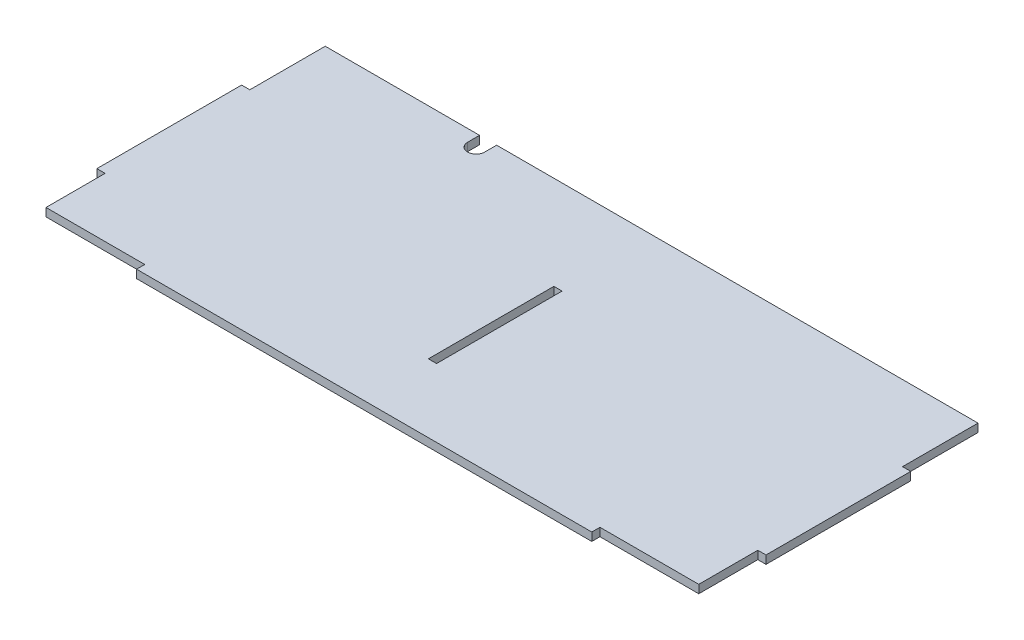
ISO-10303-21;
HEADER;
FILE_DESCRIPTION(('STEP AP214'),'2;1');
FILE_NAME('part.step','',(''),(''),'','','');
FILE_SCHEMA(('AUTOMOTIVE_DESIGN { 1 0 10303 214 1 1 1 1 }'));
ENDSEC;
DATA;
#1=APPLICATION_CONTEXT('core data for automotive mechanical design processes');
#2=APPLICATION_PROTOCOL_DEFINITION('international standard','automotive_design',2000,#1);
#3=PRODUCT_CONTEXT('',#1,'mechanical');
#4=PRODUCT('Part','Part','',(#3));
#5=PRODUCT_RELATED_PRODUCT_CATEGORY('part','',(#4));
#6=PRODUCT_DEFINITION_FORMATION('','',#4);
#7=PRODUCT_DEFINITION_CONTEXT('part definition',#1,'design');
#8=PRODUCT_DEFINITION('design','',#6,#7);
#9=PRODUCT_DEFINITION_SHAPE('','',#8);
#10=(LENGTH_UNIT() NAMED_UNIT(*) SI_UNIT(.MILLI.,.METRE.));
#11=(NAMED_UNIT(*) PLANE_ANGLE_UNIT() SI_UNIT($,.RADIAN.));
#12=(NAMED_UNIT(*) SI_UNIT($,.STERADIAN.) SOLID_ANGLE_UNIT());
#13=UNCERTAINTY_MEASURE_WITH_UNIT(LENGTH_MEASURE(1.E-05),#10,'distance_accuracy_value','');
#14=(GEOMETRIC_REPRESENTATION_CONTEXT(3) GLOBAL_UNCERTAINTY_ASSIGNED_CONTEXT((#13)) GLOBAL_UNIT_ASSIGNED_CONTEXT((#10,
#11,#12)) REPRESENTATION_CONTEXT('',''));
#15=CARTESIAN_POINT('',(0.,0.,0.));
#16=DIRECTION('',(0.,0.,1.));
#17=DIRECTION('',(1.,0.,0.));
#18=AXIS2_PLACEMENT_3D('',#15,#16,#17);
#19=CARTESIAN_POINT('',(0.,6.,-210.49));
#20=DIRECTION('',(0.,0.,1.));
#21=DIRECTION('',(1.,0.,0.));
#22=AXIS2_PLACEMENT_3D('',#19,#20,#21);
#23=PLANE('',#22);
#24=DIRECTION('',(-1.,0.,0.));
#25=VECTOR('',#24,1.);
#26=CARTESIAN_POINT('',(0.,0.,-210.49));
#27=LINE('',#26,#25);
#28=CARTESIAN_POINT('',(484.,0.,-210.49));
#29=VERTEX_POINT('',#28);
#30=CARTESIAN_POINT('',(131.5,0.,-210.49));
#31=VERTEX_POINT('',#30);
#32=EDGE_CURVE('E37',#29,#31,#27,.T.);
#33=ORIENTED_EDGE('',*,*,#32,.T.);
#34=DIRECTION('',(0.,1.,0.));
#35=VECTOR('',#34,1.);
#36=CARTESIAN_POINT('',(131.5,0.,-210.49));
#37=LINE('',#36,#35);
#38=CARTESIAN_POINT('',(131.5,6.,-210.49));
#39=VERTEX_POINT('',#38);
#40=EDGE_CURVE('E362',#31,#39,#37,.T.);
#41=ORIENTED_EDGE('',*,*,#40,.T.);
#42=DIRECTION('',(-1.,0.,0.));
#43=VECTOR('',#42,1.);
#44=CARTESIAN_POINT('',(0.,6.,-210.49));
#45=LINE('',#44,#43);
#46=CARTESIAN_POINT('',(484.,6.,-210.49));
#47=VERTEX_POINT('',#46);
#48=EDGE_CURVE('E11',#47,#39,#45,.T.);
#49=ORIENTED_EDGE('',*,*,#48,.F.);
#50=DIRECTION('',(0.,1.,0.));
#51=VECTOR('',#50,1.);
#52=CARTESIAN_POINT('',(484.,0.,-210.49));
#53=LINE('',#52,#51);
#54=EDGE_CURVE('E328',#29,#47,#53,.T.);
#55=ORIENTED_EDGE('',*,*,#54,.F.);
#56=EDGE_LOOP('',(#33,#41,#49,#55));
#57=FACE_BOUND('',#56,.T.);
#58=ADVANCED_FACE('F33',(#57),#23,.F.);
#59=CARTESIAN_POINT('',(0.,6.,0.));
#60=DIRECTION('',(1.,0.,0.));
#61=DIRECTION('',(0.,0.,-1.));
#62=AXIS2_PLACEMENT_3D('',#59,#60,#61);
#63=PLANE('',#62);
#64=DIRECTION('',(0.,0.,1.));
#65=VECTOR('',#64,1.);
#66=CARTESIAN_POINT('',(0.,6.,0.));
#67=LINE('',#66,#65);
#68=CARTESIAN_POINT('',(0.,6.,-155.24));
#69=VERTEX_POINT('',#68);
#70=CARTESIAN_POINT('',(0.,6.,-49.25));
#71=VERTEX_POINT('',#70);
#72=EDGE_CURVE('E222',#69,#71,#67,.T.);
#73=ORIENTED_EDGE('',*,*,#72,.F.);
#74=DIRECTION('',(0.,1.,0.));
#75=VECTOR('',#74,1.);
#76=CARTESIAN_POINT('',(0.,0.,-155.24));
#77=LINE('',#76,#75);
#78=CARTESIAN_POINT('',(0.,0.,-155.24));
#79=VERTEX_POINT('',#78);
#80=EDGE_CURVE('E313',#79,#69,#77,.T.);
#81=ORIENTED_EDGE('',*,*,#80,.F.);
#82=DIRECTION('',(0.,0.,1.));
#83=VECTOR('',#82,1.);
#84=CARTESIAN_POINT('',(0.,0.,0.));
#85=LINE('',#84,#83);
#86=CARTESIAN_POINT('',(0.,0.,-49.25));
#87=VERTEX_POINT('',#86);
#88=EDGE_CURVE('E229',#79,#87,#85,.T.);
#89=ORIENTED_EDGE('',*,*,#88,.T.);
#90=DIRECTION('',(0.,1.,0.));
#91=VECTOR('',#90,1.);
#92=CARTESIAN_POINT('',(0.,0.,-49.25));
#93=LINE('',#92,#91);
#94=EDGE_CURVE('E286',#87,#71,#93,.T.);
#95=ORIENTED_EDGE('',*,*,#94,.T.);
#96=EDGE_LOOP('',(#73,#81,#89,#95));
#97=FACE_BOUND('',#96,.T.);
#98=ADVANCED_FACE('F35',(#97),#63,.F.);
#99=CARTESIAN_POINT('',(0.,6.,0.));
#100=DIRECTION('',(0.,0.,-1.));
#101=DIRECTION('',(-1.,0.,0.));
#102=AXIS2_PLACEMENT_3D('',#99,#100,#101);
#103=PLANE('',#102);
#104=DIRECTION('',(1.,0.,0.));
#105=VECTOR('',#104,1.);
#106=CARTESIAN_POINT('',(0.,6.,0.));
#107=LINE('',#106,#105);
#108=CARTESIAN_POINT('',(78.33333333,6.,0.));
#109=VERTEX_POINT('',#108);
#110=CARTESIAN_POINT('',(411.666666663333,6.,0.));
#111=VERTEX_POINT('',#110);
#112=EDGE_CURVE('E238',#109,#111,#107,.T.);
#113=ORIENTED_EDGE('',*,*,#112,.F.);
#114=DIRECTION('',(0.,1.,0.));
#115=VECTOR('',#114,1.);
#116=CARTESIAN_POINT('',(78.33333333,0.,0.));
#117=LINE('',#116,#115);
#118=CARTESIAN_POINT('',(78.33333333,0.,0.));
#119=VERTEX_POINT('',#118);
#120=EDGE_CURVE('E277',#119,#109,#117,.T.);
#121=ORIENTED_EDGE('',*,*,#120,.F.);
#122=DIRECTION('',(1.,0.,0.));
#123=VECTOR('',#122,1.);
#124=CARTESIAN_POINT('',(0.,0.,0.));
#125=LINE('',#124,#123);
#126=CARTESIAN_POINT('',(411.666666663333,0.,0.));
#127=VERTEX_POINT('',#126);
#128=EDGE_CURVE('E224',#119,#127,#125,.T.);
#129=ORIENTED_EDGE('',*,*,#128,.T.);
#130=DIRECTION('',(0.,1.,0.));
#131=VECTOR('',#130,1.);
#132=CARTESIAN_POINT('',(411.666666663333,0.,0.));
#133=LINE('',#132,#131);
#134=EDGE_CURVE('E233',#127,#111,#133,.T.);
#135=ORIENTED_EDGE('',*,*,#134,.T.);
#136=EDGE_LOOP('',(#113,#121,#129,#135));
#137=FACE_BOUND('',#136,.T.);
#138=ADVANCED_FACE('F422',(#137),#103,.F.);
#139=CARTESIAN_POINT('',(490.,6.,0.));
#140=DIRECTION('',(-1.,0.,0.));
#141=DIRECTION('',(0.,0.,1.));
#142=AXIS2_PLACEMENT_3D('',#139,#140,#141);
#143=PLANE('',#142);
#144=DIRECTION('',(0.,0.,-1.));
#145=VECTOR('',#144,1.);
#146=CARTESIAN_POINT('',(490.,0.,0.));
#147=LINE('',#146,#145);
#148=CARTESIAN_POINT('',(490.,0.,-49.25));
#149=VERTEX_POINT('',#148);
#150=CARTESIAN_POINT('',(490.,0.,-155.24));
#151=VERTEX_POINT('',#150);
#152=EDGE_CURVE('E220',#149,#151,#147,.T.);
#153=ORIENTED_EDGE('',*,*,#152,.T.);
#154=DIRECTION('',(0.,1.,0.));
#155=VECTOR('',#154,1.);
#156=CARTESIAN_POINT('',(490.,0.,-155.24));
#157=LINE('',#156,#155);
#158=CARTESIAN_POINT('',(490.,6.,-155.24));
#159=VERTEX_POINT('',#158);
#160=EDGE_CURVE('E266',#151,#159,#157,.T.);
#161=ORIENTED_EDGE('',*,*,#160,.T.);
#162=DIRECTION('',(0.,0.,-1.));
#163=VECTOR('',#162,1.);
#164=CARTESIAN_POINT('',(490.,6.,0.));
#165=LINE('',#164,#163);
#166=CARTESIAN_POINT('',(490.,6.,-49.25));
#167=VERTEX_POINT('',#166);
#168=EDGE_CURVE('E235',#167,#159,#165,.T.);
#169=ORIENTED_EDGE('',*,*,#168,.F.);
#170=DIRECTION('',(0.,1.,0.));
#171=VECTOR('',#170,1.);
#172=CARTESIAN_POINT('',(490.,0.,-49.25));
#173=LINE('',#172,#171);
#174=EDGE_CURVE('E242',#149,#167,#173,.T.);
#175=ORIENTED_EDGE('',*,*,#174,.F.);
#176=EDGE_LOOP('',(#153,#161,#169,#175));
#177=FACE_BOUND('',#176,.T.);
#178=ADVANCED_FACE('F403',(#177),#143,.F.);
#179=CARTESIAN_POINT('',(119.,6.,-210.49));
#180=VERTEX_POINT('',#179);
#181=CARTESIAN_POINT('',(6.,6.,-210.49));
#182=VERTEX_POINT('',#181);
#183=EDGE_CURVE('E42',#180,#182,#45,.T.);
#184=ORIENTED_EDGE('',*,*,#183,.F.);
#185=DIRECTION('',(0.,1.,0.));
#186=VECTOR('',#185,1.);
#187=CARTESIAN_POINT('',(119.,0.,-210.49));
#188=LINE('',#187,#186);
#189=CARTESIAN_POINT('',(119.,0.,-210.49));
#190=VERTEX_POINT('',#189);
#191=EDGE_CURVE('E199',#190,#180,#188,.T.);
#192=ORIENTED_EDGE('',*,*,#191,.F.);
#193=CARTESIAN_POINT('',(6.,0.,-210.49));
#194=VERTEX_POINT('',#193);
#195=EDGE_CURVE('E210',#190,#194,#27,.T.);
#196=ORIENTED_EDGE('',*,*,#195,.T.);
#197=DIRECTION('',(0.,1.,0.));
#198=VECTOR('',#197,1.);
#199=CARTESIAN_POINT('',(6.,0.,-210.49));
#200=LINE('',#199,#198);
#201=EDGE_CURVE('E317',#194,#182,#200,.T.);
#202=ORIENTED_EDGE('',*,*,#201,.T.);
#203=EDGE_LOOP('',(#184,#192,#196,#202));
#204=FACE_BOUND('',#203,.T.);
#205=ADVANCED_FACE('F208',(#204),#23,.F.);
#206=CARTESIAN_POINT('',(0.,6.,0.));
#207=DIRECTION('',(0.,-1.,0.));
#208=DIRECTION('',(0.,0.,-1.));
#209=AXIS2_PLACEMENT_3D('',#206,#207,#208);
#210=PLANE('',#209);
#211=DIRECTION('',(1.,0.,0.));
#212=VECTOR('',#211,1.);
#213=CARTESIAN_POINT('',(242.,6.,-50.));
#214=LINE('',#213,#212);
#215=CARTESIAN_POINT('',(242.,6.,-50.));
#216=VERTEX_POINT('',#215);
#217=CARTESIAN_POINT('',(248.,6.,-50.));
#218=VERTEX_POINT('',#217);
#219=EDGE_CURVE('E358',#216,#218,#214,.T.);
#220=ORIENTED_EDGE('',*,*,#219,.F.);
#221=DIRECTION('',(0.,0.,1.));
#222=VECTOR('',#221,1.);
#223=CARTESIAN_POINT('',(242.,6.,-141.92));
#224=LINE('',#223,#222);
#225=CARTESIAN_POINT('',(242.,6.,-141.92));
#226=VERTEX_POINT('',#225);
#227=EDGE_CURVE('E58',#226,#216,#224,.T.);
#228=ORIENTED_EDGE('',*,*,#227,.F.);
#229=DIRECTION('',(-1.,0.,0.));
#230=VECTOR('',#229,1.);
#231=CARTESIAN_POINT('',(242.,6.,-141.92));
#232=LINE('',#231,#230);
#233=CARTESIAN_POINT('',(248.,6.,-141.92));
#234=VERTEX_POINT('',#233);
#235=EDGE_CURVE('E351',#234,#226,#232,.T.);
#236=ORIENTED_EDGE('',*,*,#235,.F.);
#237=DIRECTION('',(0.,0.,-1.));
#238=VECTOR('',#237,1.);
#239=CARTESIAN_POINT('',(248.,6.,-141.92));
#240=LINE('',#239,#238);
#241=EDGE_CURVE('E355',#218,#234,#240,.T.);
#242=ORIENTED_EDGE('',*,*,#241,.F.);
#243=EDGE_LOOP('',(#220,#228,#236,#242));
#244=FACE_BOUND('',#243,.T.);
#245=ORIENTED_EDGE('',*,*,#48,.T.);
#246=DIRECTION('',(0.,0.,-1.));
#247=VECTOR('',#246,1.);
#248=CARTESIAN_POINT('',(131.5,6.,-201.74));
#249=LINE('',#248,#247);
#250=CARTESIAN_POINT('',(131.5,6.,-201.74));
#251=VERTEX_POINT('',#250);
#252=EDGE_CURVE('E204',#251,#39,#249,.T.);
#253=ORIENTED_EDGE('',*,*,#252,.F.);
#254=CARTESIAN_POINT('',(125.25,6.,-201.74));
#255=DIRECTION('',(0.,1.,0.));
#256=DIRECTION('',(0.,0.,1.));
#257=AXIS2_PLACEMENT_3D('',#254,#255,#256);
#258=CIRCLE('',#257,6.25000000000001);
#259=CARTESIAN_POINT('',(119.,6.,-201.74));
#260=VERTEX_POINT('',#259);
#261=EDGE_CURVE('E379',#260,#251,#258,.T.);
#262=ORIENTED_EDGE('',*,*,#261,.F.);
#263=DIRECTION('',(0.,0.,1.));
#264=VECTOR('',#263,1.);
#265=CARTESIAN_POINT('',(119.,6.,-210.49));
#266=LINE('',#265,#264);
#267=EDGE_CURVE('E382',#180,#260,#266,.T.);
#268=ORIENTED_EDGE('',*,*,#267,.F.);
#269=ORIENTED_EDGE('',*,*,#183,.T.);
#270=DIRECTION('',(0.,0.,-1.));
#271=VECTOR('',#270,1.);
#272=CARTESIAN_POINT('',(6.,6.,-210.49));
#273=LINE('',#272,#271);
#274=CARTESIAN_POINT('',(6.00000000000001,6.,-155.24));
#275=VERTEX_POINT('',#274);
#276=EDGE_CURVE('E320',#275,#182,#273,.T.);
#277=ORIENTED_EDGE('',*,*,#276,.F.);
#278=DIRECTION('',(1.,0.,0.));
#279=VECTOR('',#278,1.);
#280=CARTESIAN_POINT('',(0.,6.,-155.24));
#281=LINE('',#280,#279);
#282=EDGE_CURVE('E289',#69,#275,#281,.T.);
#283=ORIENTED_EDGE('',*,*,#282,.F.);
#284=ORIENTED_EDGE('',*,*,#72,.T.);
#285=DIRECTION('',(-1.,0.,0.));
#286=VECTOR('',#285,1.);
#287=CARTESIAN_POINT('',(0.,6.,-49.25));
#288=LINE('',#287,#286);
#289=CARTESIAN_POINT('',(6.,6.,-49.25));
#290=VERTEX_POINT('',#289);
#291=EDGE_CURVE('E290',#290,#71,#288,.T.);
#292=ORIENTED_EDGE('',*,*,#291,.F.);
#293=DIRECTION('',(0.,0.,-1.));
#294=VECTOR('',#293,1.);
#295=CARTESIAN_POINT('',(6.,6.,-49.25));
#296=LINE('',#295,#294);
#297=CARTESIAN_POINT('',(6.00000000000001,6.,-6.));
#298=VERTEX_POINT('',#297);
#299=EDGE_CURVE('E293',#298,#290,#296,.T.);
#300=ORIENTED_EDGE('',*,*,#299,.F.);
#301=DIRECTION('',(-1.,0.,0.));
#302=VECTOR('',#301,1.);
#303=CARTESIAN_POINT('',(6.00000000000001,6.,-6.));
#304=LINE('',#303,#302);
#305=CARTESIAN_POINT('',(78.33333333,6.,-6.));
#306=VERTEX_POINT('',#305);
#307=EDGE_CURVE('E296',#306,#298,#304,.T.);
#308=ORIENTED_EDGE('',*,*,#307,.F.);
#309=DIRECTION('',(0.,0.,-1.));
#310=VECTOR('',#309,1.);
#311=CARTESIAN_POINT('',(78.33333333,6.,-6.));
#312=LINE('',#311,#310);
#313=EDGE_CURVE('E299',#109,#306,#312,.T.);
#314=ORIENTED_EDGE('',*,*,#313,.F.);
#315=ORIENTED_EDGE('',*,*,#112,.T.);
#316=DIRECTION('',(0.,0.,1.));
#317=VECTOR('',#316,1.);
#318=CARTESIAN_POINT('',(411.666666663333,6.,-5.99999999999999));
#319=LINE('',#318,#317);
#320=CARTESIAN_POINT('',(411.666666663333,6.,-5.99999999999999));
#321=VERTEX_POINT('',#320);
#322=EDGE_CURVE('E253',#321,#111,#319,.T.);
#323=ORIENTED_EDGE('',*,*,#322,.F.);
#324=DIRECTION('',(-1.,0.,0.));
#325=VECTOR('',#324,1.);
#326=CARTESIAN_POINT('',(411.666666663333,6.,-5.99999999999999));
#327=LINE('',#326,#325);
#328=CARTESIAN_POINT('',(484.,6.,-5.99999999999999));
#329=VERTEX_POINT('',#328);
#330=EDGE_CURVE('E257',#329,#321,#327,.T.);
#331=ORIENTED_EDGE('',*,*,#330,.F.);
#332=DIRECTION('',(0.,0.,1.));
#333=VECTOR('',#332,1.);
#334=CARTESIAN_POINT('',(484.,6.,-5.99999999999999));
#335=LINE('',#334,#333);
#336=CARTESIAN_POINT('',(484.,6.,-49.25));
#337=VERTEX_POINT('',#336);
#338=EDGE_CURVE('E260',#337,#329,#335,.T.);
#339=ORIENTED_EDGE('',*,*,#338,.F.);
#340=DIRECTION('',(-1.,0.,0.));
#341=VECTOR('',#340,1.);
#342=CARTESIAN_POINT('',(484.,6.,-49.25));
#343=LINE('',#342,#341);
#344=EDGE_CURVE('E263',#167,#337,#343,.T.);
#345=ORIENTED_EDGE('',*,*,#344,.F.);
#346=ORIENTED_EDGE('',*,*,#168,.T.);
#347=DIRECTION('',(1.,0.,0.));
#348=VECTOR('',#347,1.);
#349=CARTESIAN_POINT('',(490.,6.,-155.24));
#350=LINE('',#349,#348);
#351=CARTESIAN_POINT('',(484.,6.,-155.24));
#352=VERTEX_POINT('',#351);
#353=EDGE_CURVE('E334',#352,#159,#350,.T.);
#354=ORIENTED_EDGE('',*,*,#353,.F.);
#355=DIRECTION('',(0.,0.,1.));
#356=VECTOR('',#355,1.);
#357=CARTESIAN_POINT('',(484.,6.,-210.49));
#358=LINE('',#357,#356);
#359=EDGE_CURVE('E319',#47,#352,#358,.T.);
#360=ORIENTED_EDGE('',*,*,#359,.F.);
#361=EDGE_LOOP('',(#245,#253,#262,#268,#269,#277,#283,#284,#292,#300,#308,#314,#315,#323,#331,
#339,#345,#346,#354,#360));
#362=FACE_BOUND('',#361,.T.);
#363=ADVANCED_FACE('F397',(#244,#362),#210,.F.);
#364=CARTESIAN_POINT('',(0.,0.,0.));
#365=DIRECTION('',(0.,-1.,0.));
#366=DIRECTION('',(0.,0.,-1.));
#367=AXIS2_PLACEMENT_3D('',#364,#365,#366);
#368=PLANE('',#367);
#369=DIRECTION('',(0.,0.,-1.));
#370=VECTOR('',#369,1.);
#371=CARTESIAN_POINT('',(131.5,0.,-201.74));
#372=LINE('',#371,#370);
#373=CARTESIAN_POINT('',(131.5,0.,-201.74));
#374=VERTEX_POINT('',#373);
#375=EDGE_CURVE('E212',#374,#31,#372,.T.);
#376=ORIENTED_EDGE('',*,*,#375,.T.);
#377=ORIENTED_EDGE('',*,*,#32,.F.);
#378=DIRECTION('',(0.,0.,1.));
#379=VECTOR('',#378,1.);
#380=CARTESIAN_POINT('',(484.,0.,-210.49));
#381=LINE('',#380,#379);
#382=CARTESIAN_POINT('',(484.,0.,-155.24));
#383=VERTEX_POINT('',#382);
#384=EDGE_CURVE('E336',#29,#383,#381,.T.);
#385=ORIENTED_EDGE('',*,*,#384,.T.);
#386=DIRECTION('',(1.,0.,0.));
#387=VECTOR('',#386,1.);
#388=CARTESIAN_POINT('',(490.,0.,-155.24));
#389=LINE('',#388,#387);
#390=EDGE_CURVE('E331',#383,#151,#389,.T.);
#391=ORIENTED_EDGE('',*,*,#390,.T.);
#392=ORIENTED_EDGE('',*,*,#152,.F.);
#393=DIRECTION('',(-1.,0.,0.));
#394=VECTOR('',#393,1.);
#395=CARTESIAN_POINT('',(484.,0.,-49.25));
#396=LINE('',#395,#394);
#397=CARTESIAN_POINT('',(484.,0.,-49.25));
#398=VERTEX_POINT('',#397);
#399=EDGE_CURVE('E256',#149,#398,#396,.T.);
#400=ORIENTED_EDGE('',*,*,#399,.T.);
#401=DIRECTION('',(0.,0.,1.));
#402=VECTOR('',#401,1.);
#403=CARTESIAN_POINT('',(484.,0.,-5.99999999999999));
#404=LINE('',#403,#402);
#405=CARTESIAN_POINT('',(484.,0.,-5.99999999999999));
#406=VERTEX_POINT('',#405);
#407=EDGE_CURVE('E272',#398,#406,#404,.T.);
#408=ORIENTED_EDGE('',*,*,#407,.T.);
#409=DIRECTION('',(-1.,0.,0.));
#410=VECTOR('',#409,1.);
#411=CARTESIAN_POINT('',(411.666666663333,0.,-5.99999999999999));
#412=LINE('',#411,#410);
#413=CARTESIAN_POINT('',(411.666666663333,0.,-5.99999999999999));
#414=VERTEX_POINT('',#413);
#415=EDGE_CURVE('E269',#406,#414,#412,.T.);
#416=ORIENTED_EDGE('',*,*,#415,.T.);
#417=DIRECTION('',(0.,0.,1.));
#418=VECTOR('',#417,1.);
#419=CARTESIAN_POINT('',(411.666666663333,0.,-5.99999999999999));
#420=LINE('',#419,#418);
#421=EDGE_CURVE('E245',#414,#127,#420,.T.);
#422=ORIENTED_EDGE('',*,*,#421,.T.);
#423=ORIENTED_EDGE('',*,*,#128,.F.);
#424=DIRECTION('',(0.,0.,-1.));
#425=VECTOR('',#424,1.);
#426=CARTESIAN_POINT('',(78.33333333,0.,-6.));
#427=LINE('',#426,#425);
#428=CARTESIAN_POINT('',(78.33333333,0.,-6.));
#429=VERTEX_POINT('',#428);
#430=EDGE_CURVE('E292',#119,#429,#427,.T.);
#431=ORIENTED_EDGE('',*,*,#430,.T.);
#432=DIRECTION('',(-1.,0.,0.));
#433=VECTOR('',#432,1.);
#434=CARTESIAN_POINT('',(6.00000000000001,0.,-6.));
#435=LINE('',#434,#433);
#436=CARTESIAN_POINT('',(6.00000000000001,0.,-6.));
#437=VERTEX_POINT('',#436);
#438=EDGE_CURVE('E308',#429,#437,#435,.T.);
#439=ORIENTED_EDGE('',*,*,#438,.T.);
#440=DIRECTION('',(0.,0.,-1.));
#441=VECTOR('',#440,1.);
#442=CARTESIAN_POINT('',(6.,0.,-49.25));
#443=LINE('',#442,#441);
#444=CARTESIAN_POINT('',(6.,0.,-49.25));
#445=VERTEX_POINT('',#444);
#446=EDGE_CURVE('E305',#437,#445,#443,.T.);
#447=ORIENTED_EDGE('',*,*,#446,.T.);
#448=DIRECTION('',(-1.,0.,0.));
#449=VECTOR('',#448,1.);
#450=CARTESIAN_POINT('',(0.,0.,-49.25));
#451=LINE('',#450,#449);
#452=EDGE_CURVE('E280',#445,#87,#451,.T.);
#453=ORIENTED_EDGE('',*,*,#452,.T.);
#454=ORIENTED_EDGE('',*,*,#88,.F.);
#455=DIRECTION('',(1.,0.,0.));
#456=VECTOR('',#455,1.);
#457=CARTESIAN_POINT('',(0.,0.,-155.24));
#458=LINE('',#457,#456);
#459=CARTESIAN_POINT('',(6.00000000000001,0.,-155.24));
#460=VERTEX_POINT('',#459);
#461=EDGE_CURVE('E323',#79,#460,#458,.T.);
#462=ORIENTED_EDGE('',*,*,#461,.T.);
#463=DIRECTION('',(0.,0.,-1.));
#464=VECTOR('',#463,1.);
#465=CARTESIAN_POINT('',(6.,0.,-210.49));
#466=LINE('',#465,#464);
#467=EDGE_CURVE('E219',#460,#194,#466,.T.);
#468=ORIENTED_EDGE('',*,*,#467,.T.);
#469=ORIENTED_EDGE('',*,*,#195,.F.);
#470=DIRECTION('',(0.,0.,1.));
#471=VECTOR('',#470,1.);
#472=CARTESIAN_POINT('',(119.,0.,-210.49));
#473=LINE('',#472,#471);
#474=CARTESIAN_POINT('',(119.,0.,-201.74));
#475=VERTEX_POINT('',#474);
#476=EDGE_CURVE('E195',#190,#475,#473,.T.);
#477=ORIENTED_EDGE('',*,*,#476,.T.);
#478=CARTESIAN_POINT('',(125.25,0.,-201.74));
#479=DIRECTION('',(0.,1.,0.));
#480=DIRECTION('',(0.,0.,1.));
#481=AXIS2_PLACEMENT_3D('',#478,#479,#480);
#482=CIRCLE('',#481,6.25000000000001);
#483=EDGE_CURVE('E50',#475,#374,#482,.T.);
#484=ORIENTED_EDGE('',*,*,#483,.T.);
#485=EDGE_LOOP('',(#376,#377,#385,#391,#392,#400,#408,#416,#422,#423,#431,#439,#447,#453,#454,
#462,#468,#469,#477,#484));
#486=FACE_BOUND('',#485,.T.);
#487=DIRECTION('',(0.,0.,1.));
#488=VECTOR('',#487,1.);
#489=CARTESIAN_POINT('',(242.,0.,-141.92));
#490=LINE('',#489,#488);
#491=CARTESIAN_POINT('',(242.,0.,-141.92));
#492=VERTEX_POINT('',#491);
#493=CARTESIAN_POINT('',(242.,0.,-50.));
#494=VERTEX_POINT('',#493);
#495=EDGE_CURVE('E354',#492,#494,#490,.T.);
#496=ORIENTED_EDGE('',*,*,#495,.T.);
#497=DIRECTION('',(1.,0.,0.));
#498=VECTOR('',#497,1.);
#499=CARTESIAN_POINT('',(242.,0.,-50.));
#500=LINE('',#499,#498);
#501=CARTESIAN_POINT('',(248.,0.,-50.));
#502=VERTEX_POINT('',#501);
#503=EDGE_CURVE('E368',#494,#502,#500,.T.);
#504=ORIENTED_EDGE('',*,*,#503,.T.);
#505=DIRECTION('',(0.,0.,-1.));
#506=VECTOR('',#505,1.);
#507=CARTESIAN_POINT('',(248.,0.,-141.92));
#508=LINE('',#507,#506);
#509=CARTESIAN_POINT('',(248.,0.,-141.92));
#510=VERTEX_POINT('',#509);
#511=EDGE_CURVE('E365',#502,#510,#508,.T.);
#512=ORIENTED_EDGE('',*,*,#511,.T.);
#513=DIRECTION('',(-1.,0.,0.));
#514=VECTOR('',#513,1.);
#515=CARTESIAN_POINT('',(242.,0.,-141.92));
#516=LINE('',#515,#514);
#517=EDGE_CURVE('E346',#510,#492,#516,.T.);
#518=ORIENTED_EDGE('',*,*,#517,.T.);
#519=EDGE_LOOP('',(#496,#504,#512,#518));
#520=FACE_BOUND('',#519,.T.);
#521=ADVANCED_FACE('F216',(#486,#520),#368,.T.);
#522=CARTESIAN_POINT('',(411.666666663333,0.,-5.99999999999999));
#523=DIRECTION('',(-1.,0.,0.));
#524=DIRECTION('',(0.,0.,1.));
#525=AXIS2_PLACEMENT_3D('',#522,#523,#524);
#526=PLANE('',#525);
#527=ORIENTED_EDGE('',*,*,#322,.T.);
#528=ORIENTED_EDGE('',*,*,#134,.F.);
#529=ORIENTED_EDGE('',*,*,#421,.F.);
#530=DIRECTION('',(0.,1.,0.));
#531=VECTOR('',#530,1.);
#532=CARTESIAN_POINT('',(411.666666663333,0.,-5.99999999999999));
#533=LINE('',#532,#531);
#534=EDGE_CURVE('E249',#414,#321,#533,.T.);
#535=ORIENTED_EDGE('',*,*,#534,.T.);
#536=EDGE_LOOP('',(#527,#528,#529,#535));
#537=FACE_BOUND('',#536,.T.);
#538=ADVANCED_FACE('F418',(#537),#526,.F.);
#539=CARTESIAN_POINT('',(411.666666663333,0.,-5.99999999999999));
#540=DIRECTION('',(0.,0.,-1.));
#541=DIRECTION('',(-1.,0.,0.));
#542=AXIS2_PLACEMENT_3D('',#539,#540,#541);
#543=PLANE('',#542);
#544=ORIENTED_EDGE('',*,*,#330,.T.);
#545=ORIENTED_EDGE('',*,*,#534,.F.);
#546=ORIENTED_EDGE('',*,*,#415,.F.);
#547=DIRECTION('',(0.,1.,0.));
#548=VECTOR('',#547,1.);
#549=CARTESIAN_POINT('',(484.,0.,-5.99999999999999));
#550=LINE('',#549,#548);
#551=EDGE_CURVE('E247',#406,#329,#550,.T.);
#552=ORIENTED_EDGE('',*,*,#551,.T.);
#553=EDGE_LOOP('',(#544,#545,#546,#552));
#554=FACE_BOUND('',#553,.T.);
#555=ADVANCED_FACE('F413',(#554),#543,.F.);
#556=CARTESIAN_POINT('',(484.,0.,-5.99999999999999));
#557=DIRECTION('',(-1.,0.,0.));
#558=DIRECTION('',(0.,0.,1.));
#559=AXIS2_PLACEMENT_3D('',#556,#557,#558);
#560=PLANE('',#559);
#561=ORIENTED_EDGE('',*,*,#338,.T.);
#562=ORIENTED_EDGE('',*,*,#551,.F.);
#563=ORIENTED_EDGE('',*,*,#407,.F.);
#564=DIRECTION('',(0.,1.,0.));
#565=VECTOR('',#564,1.);
#566=CARTESIAN_POINT('',(484.,0.,-49.25));
#567=LINE('',#566,#565);
#568=EDGE_CURVE('E244',#398,#337,#567,.T.);
#569=ORIENTED_EDGE('',*,*,#568,.T.);
#570=EDGE_LOOP('',(#561,#562,#563,#569));
#571=FACE_BOUND('',#570,.T.);
#572=ADVANCED_FACE('F409',(#571),#560,.F.);
#573=CARTESIAN_POINT('',(484.,0.,-49.25));
#574=DIRECTION('',(0.,0.,-1.));
#575=DIRECTION('',(-1.,0.,0.));
#576=AXIS2_PLACEMENT_3D('',#573,#574,#575);
#577=PLANE('',#576);
#578=ORIENTED_EDGE('',*,*,#344,.T.);
#579=ORIENTED_EDGE('',*,*,#568,.F.);
#580=ORIENTED_EDGE('',*,*,#399,.F.);
#581=ORIENTED_EDGE('',*,*,#174,.T.);
#582=EDGE_LOOP('',(#578,#579,#580,#581));
#583=FACE_BOUND('',#582,.T.);
#584=ADVANCED_FACE('F406',(#583),#577,.F.);
#585=CARTESIAN_POINT('',(0.,0.,-49.25));
#586=DIRECTION('',(0.,0.,-1.));
#587=DIRECTION('',(-1.,0.,0.));
#588=AXIS2_PLACEMENT_3D('',#585,#586,#587);
#589=PLANE('',#588);
#590=ORIENTED_EDGE('',*,*,#291,.T.);
#591=ORIENTED_EDGE('',*,*,#94,.F.);
#592=ORIENTED_EDGE('',*,*,#452,.F.);
#593=DIRECTION('',(0.,1.,0.));
#594=VECTOR('',#593,1.);
#595=CARTESIAN_POINT('',(6.,0.,-49.25));
#596=LINE('',#595,#594);
#597=EDGE_CURVE('E284',#445,#290,#596,.T.);
#598=ORIENTED_EDGE('',*,*,#597,.T.);
#599=EDGE_LOOP('',(#590,#591,#592,#598));
#600=FACE_BOUND('',#599,.T.);
#601=ADVANCED_FACE('F439',(#600),#589,.F.);
#602=CARTESIAN_POINT('',(6.,0.,-49.25));
#603=DIRECTION('',(1.,0.,0.));
#604=DIRECTION('',(0.,0.,-1.));
#605=AXIS2_PLACEMENT_3D('',#602,#603,#604);
#606=PLANE('',#605);
#607=ORIENTED_EDGE('',*,*,#299,.T.);
#608=ORIENTED_EDGE('',*,*,#597,.F.);
#609=ORIENTED_EDGE('',*,*,#446,.F.);
#610=DIRECTION('',(0.,1.,0.));
#611=VECTOR('',#610,1.);
#612=CARTESIAN_POINT('',(6.00000000000001,0.,-6.));
#613=LINE('',#612,#611);
#614=EDGE_CURVE('E282',#437,#298,#613,.T.);
#615=ORIENTED_EDGE('',*,*,#614,.T.);
#616=EDGE_LOOP('',(#607,#608,#609,#615));
#617=FACE_BOUND('',#616,.T.);
#618=ADVANCED_FACE('F437',(#617),#606,.F.);
#619=CARTESIAN_POINT('',(6.00000000000001,0.,-6.));
#620=DIRECTION('',(0.,0.,-1.));
#621=DIRECTION('',(-1.,0.,0.));
#622=AXIS2_PLACEMENT_3D('',#619,#620,#621);
#623=PLANE('',#622);
#624=ORIENTED_EDGE('',*,*,#307,.T.);
#625=ORIENTED_EDGE('',*,*,#614,.F.);
#626=ORIENTED_EDGE('',*,*,#438,.F.);
#627=DIRECTION('',(0.,1.,0.));
#628=VECTOR('',#627,1.);
#629=CARTESIAN_POINT('',(78.33333333,0.,-6.));
#630=LINE('',#629,#628);
#631=EDGE_CURVE('E279',#429,#306,#630,.T.);
#632=ORIENTED_EDGE('',*,*,#631,.T.);
#633=EDGE_LOOP('',(#624,#625,#626,#632));
#634=FACE_BOUND('',#633,.T.);
#635=ADVANCED_FACE('F432',(#634),#623,.F.);
#636=CARTESIAN_POINT('',(78.33333333,0.,-6.));
#637=DIRECTION('',(1.,0.,0.));
#638=DIRECTION('',(0.,0.,-1.));
#639=AXIS2_PLACEMENT_3D('',#636,#637,#638);
#640=PLANE('',#639);
#641=ORIENTED_EDGE('',*,*,#313,.T.);
#642=ORIENTED_EDGE('',*,*,#631,.F.);
#643=ORIENTED_EDGE('',*,*,#430,.F.);
#644=ORIENTED_EDGE('',*,*,#120,.T.);
#645=EDGE_LOOP('',(#641,#642,#643,#644));
#646=FACE_BOUND('',#645,.T.);
#647=ADVANCED_FACE('F426',(#646),#640,.F.);
#648=CARTESIAN_POINT('',(6.,0.,-210.49));
#649=DIRECTION('',(1.,0.,0.));
#650=DIRECTION('',(0.,0.,-1.));
#651=AXIS2_PLACEMENT_3D('',#648,#649,#650);
#652=PLANE('',#651);
#653=ORIENTED_EDGE('',*,*,#276,.T.);
#654=ORIENTED_EDGE('',*,*,#201,.F.);
#655=ORIENTED_EDGE('',*,*,#467,.F.);
#656=DIRECTION('',(0.,1.,0.));
#657=VECTOR('',#656,1.);
#658=CARTESIAN_POINT('',(6.00000000000001,0.,-155.24));
#659=LINE('',#658,#657);
#660=EDGE_CURVE('E315',#460,#275,#659,.T.);
#661=ORIENTED_EDGE('',*,*,#660,.T.);
#662=EDGE_LOOP('',(#653,#654,#655,#661));
#663=FACE_BOUND('',#662,.T.);
#664=ADVANCED_FACE('F449',(#663),#652,.F.);
#665=CARTESIAN_POINT('',(0.,0.,-155.24));
#666=DIRECTION('',(0.,0.,1.));
#667=DIRECTION('',(1.,0.,0.));
#668=AXIS2_PLACEMENT_3D('',#665,#666,#667);
#669=PLANE('',#668);
#670=ORIENTED_EDGE('',*,*,#282,.T.);
#671=ORIENTED_EDGE('',*,*,#660,.F.);
#672=ORIENTED_EDGE('',*,*,#461,.F.);
#673=ORIENTED_EDGE('',*,*,#80,.T.);
#674=EDGE_LOOP('',(#670,#671,#672,#673));
#675=FACE_BOUND('',#674,.T.);
#676=ADVANCED_FACE('F447',(#675),#669,.F.);
#677=CARTESIAN_POINT('',(490.,0.,-155.24));
#678=DIRECTION('',(0.,0.,1.));
#679=DIRECTION('',(1.,0.,0.));
#680=AXIS2_PLACEMENT_3D('',#677,#678,#679);
#681=PLANE('',#680);
#682=ORIENTED_EDGE('',*,*,#353,.T.);
#683=ORIENTED_EDGE('',*,*,#160,.F.);
#684=ORIENTED_EDGE('',*,*,#390,.F.);
#685=DIRECTION('',(0.,1.,0.));
#686=VECTOR('',#685,1.);
#687=CARTESIAN_POINT('',(484.,0.,-155.24));
#688=LINE('',#687,#686);
#689=EDGE_CURVE('E330',#383,#352,#688,.T.);
#690=ORIENTED_EDGE('',*,*,#689,.T.);
#691=EDGE_LOOP('',(#682,#683,#684,#690));
#692=FACE_BOUND('',#691,.T.);
#693=ADVANCED_FACE('F402',(#692),#681,.F.);
#694=CARTESIAN_POINT('',(484.,0.,-210.49));
#695=DIRECTION('',(-1.,0.,0.));
#696=DIRECTION('',(0.,0.,1.));
#697=AXIS2_PLACEMENT_3D('',#694,#695,#696);
#698=PLANE('',#697);
#699=ORIENTED_EDGE('',*,*,#359,.T.);
#700=ORIENTED_EDGE('',*,*,#689,.F.);
#701=ORIENTED_EDGE('',*,*,#384,.F.);
#702=ORIENTED_EDGE('',*,*,#54,.T.);
#703=EDGE_LOOP('',(#699,#700,#701,#702));
#704=FACE_BOUND('',#703,.T.);
#705=ADVANCED_FACE('F393',(#704),#698,.F.);
#706=CARTESIAN_POINT('',(242.,0.,-141.92));
#707=DIRECTION('',(-1.,0.,0.));
#708=DIRECTION('',(0.,0.,1.));
#709=AXIS2_PLACEMENT_3D('',#706,#707,#708);
#710=PLANE('',#709);
#711=ORIENTED_EDGE('',*,*,#227,.T.);
#712=DIRECTION('',(0.,1.,0.));
#713=VECTOR('',#712,1.);
#714=CARTESIAN_POINT('',(242.,0.,-50.));
#715=LINE('',#714,#713);
#716=EDGE_CURVE('E343',#494,#216,#715,.T.);
#717=ORIENTED_EDGE('',*,*,#716,.F.);
#718=ORIENTED_EDGE('',*,*,#495,.F.);
#719=DIRECTION('',(0.,1.,0.));
#720=VECTOR('',#719,1.);
#721=CARTESIAN_POINT('',(242.,0.,-141.92));
#722=LINE('',#721,#720);
#723=EDGE_CURVE('E302',#492,#226,#722,.T.);
#724=ORIENTED_EDGE('',*,*,#723,.T.);
#725=EDGE_LOOP('',(#711,#717,#718,#724));
#726=FACE_BOUND('',#725,.T.);
#727=ADVANCED_FACE('F584',(#726),#710,.F.);
#728=CARTESIAN_POINT('',(242.,0.,-141.92));
#729=DIRECTION('',(0.,0.,-1.));
#730=DIRECTION('',(-1.,0.,0.));
#731=AXIS2_PLACEMENT_3D('',#728,#729,#730);
#732=PLANE('',#731);
#733=ORIENTED_EDGE('',*,*,#235,.T.);
#734=ORIENTED_EDGE('',*,*,#723,.F.);
#735=ORIENTED_EDGE('',*,*,#517,.F.);
#736=DIRECTION('',(0.,1.,0.));
#737=VECTOR('',#736,1.);
#738=CARTESIAN_POINT('',(248.,0.,-141.92));
#739=LINE('',#738,#737);
#740=EDGE_CURVE('E348',#510,#234,#739,.T.);
#741=ORIENTED_EDGE('',*,*,#740,.T.);
#742=EDGE_LOOP('',(#733,#734,#735,#741));
#743=FACE_BOUND('',#742,.T.);
#744=ADVANCED_FACE('F591',(#743),#732,.F.);
#745=CARTESIAN_POINT('',(248.,0.,-141.92));
#746=DIRECTION('',(1.,0.,0.));
#747=DIRECTION('',(0.,0.,-1.));
#748=AXIS2_PLACEMENT_3D('',#745,#746,#747);
#749=PLANE('',#748);
#750=ORIENTED_EDGE('',*,*,#241,.T.);
#751=ORIENTED_EDGE('',*,*,#740,.F.);
#752=ORIENTED_EDGE('',*,*,#511,.F.);
#753=DIRECTION('',(0.,1.,0.));
#754=VECTOR('',#753,1.);
#755=CARTESIAN_POINT('',(248.,0.,-50.));
#756=LINE('',#755,#754);
#757=EDGE_CURVE('E345',#502,#218,#756,.T.);
#758=ORIENTED_EDGE('',*,*,#757,.T.);
#759=EDGE_LOOP('',(#750,#751,#752,#758));
#760=FACE_BOUND('',#759,.T.);
#761=ADVANCED_FACE('F599',(#760),#749,.F.);
#762=CARTESIAN_POINT('',(242.,0.,-50.));
#763=DIRECTION('',(0.,0.,1.));
#764=DIRECTION('',(1.,0.,0.));
#765=AXIS2_PLACEMENT_3D('',#762,#763,#764);
#766=PLANE('',#765);
#767=ORIENTED_EDGE('',*,*,#219,.T.);
#768=ORIENTED_EDGE('',*,*,#757,.F.);
#769=ORIENTED_EDGE('',*,*,#503,.F.);
#770=ORIENTED_EDGE('',*,*,#716,.T.);
#771=EDGE_LOOP('',(#767,#768,#769,#770));
#772=FACE_BOUND('',#771,.T.);
#773=ADVANCED_FACE('F608',(#772),#766,.F.);
#774=CARTESIAN_POINT('',(131.5,0.,-201.74));
#775=DIRECTION('',(1.,0.,0.));
#776=DIRECTION('',(0.,0.,-1.));
#777=AXIS2_PLACEMENT_3D('',#774,#775,#776);
#778=PLANE('',#777);
#779=ORIENTED_EDGE('',*,*,#252,.T.);
#780=ORIENTED_EDGE('',*,*,#40,.F.);
#781=ORIENTED_EDGE('',*,*,#375,.F.);
#782=DIRECTION('',(0.,1.,0.));
#783=VECTOR('',#782,1.);
#784=CARTESIAN_POINT('',(131.5,0.,-201.74));
#785=LINE('',#784,#783);
#786=EDGE_CURVE('E374',#374,#251,#785,.T.);
#787=ORIENTED_EDGE('',*,*,#786,.T.);
#788=EDGE_LOOP('',(#779,#780,#781,#787));
#789=FACE_BOUND('',#788,.T.);
#790=ADVANCED_FACE('F615',(#789),#778,.F.);
#791=CARTESIAN_POINT('',(125.25,0.,-201.74));
#792=DIRECTION('',(0.,1.,0.));
#793=DIRECTION('',(0.,0.,1.));
#794=AXIS2_PLACEMENT_3D('',#791,#792,#793);
#795=CYLINDRICAL_SURFACE('',#794,6.25000000000001);
#796=ORIENTED_EDGE('',*,*,#261,.T.);
#797=ORIENTED_EDGE('',*,*,#786,.F.);
#798=ORIENTED_EDGE('',*,*,#483,.F.);
#799=DIRECTION('',(0.,1.,0.));
#800=VECTOR('',#799,1.);
#801=CARTESIAN_POINT('',(119.,0.,-201.74));
#802=LINE('',#801,#800);
#803=EDGE_CURVE('E201',#475,#260,#802,.T.);
#804=ORIENTED_EDGE('',*,*,#803,.T.);
#805=EDGE_LOOP('',(#796,#797,#798,#804));
#806=FACE_BOUND('',#805,.T.);
#807=ADVANCED_FACE('F629',(#806),#795,.F.);
#808=CARTESIAN_POINT('',(119.,0.,-210.49));
#809=DIRECTION('',(-1.,0.,0.));
#810=DIRECTION('',(0.,0.,1.));
#811=AXIS2_PLACEMENT_3D('',#808,#809,#810);
#812=PLANE('',#811);
#813=ORIENTED_EDGE('',*,*,#267,.T.);
#814=ORIENTED_EDGE('',*,*,#803,.F.);
#815=ORIENTED_EDGE('',*,*,#476,.F.);
#816=ORIENTED_EDGE('',*,*,#191,.T.);
#817=EDGE_LOOP('',(#813,#814,#815,#816));
#818=FACE_BOUND('',#817,.T.);
#819=ADVANCED_FACE('F198',(#818),#812,.F.);
#820=CLOSED_SHELL('',(#58,#98,#138,#178,#205,#363,#521,#538,#555,#572,#584,#601,#618,#635,#647,
#664,#676,#693,#705,#727,#744,#761,#773,#790,#807,#819));
#821=MANIFOLD_SOLID_BREP('B2',#820);
#822=ADVANCED_BREP_SHAPE_REPRESENTATION('',(#18,#821),#14);
#823=SHAPE_DEFINITION_REPRESENTATION(#9,#822);
ENDSEC;
END-ISO-10303-21;
